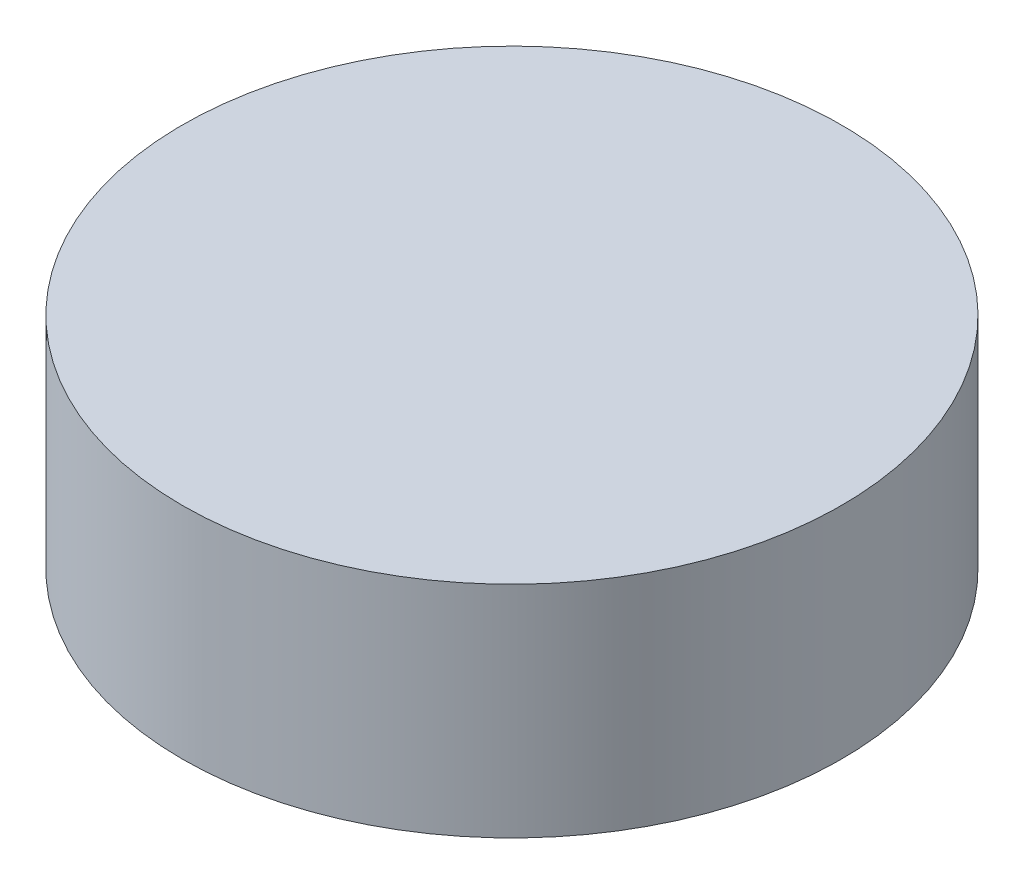
ISO-10303-21;
HEADER;
FILE_DESCRIPTION(('STEP AP214'),'2;1');
FILE_NAME('part.step','',(''),(''),'','','');
FILE_SCHEMA(('AUTOMOTIVE_DESIGN { 1 0 10303 214 1 1 1 1 }'));
ENDSEC;
DATA;
#1=APPLICATION_CONTEXT('core data for automotive mechanical design processes');
#2=APPLICATION_PROTOCOL_DEFINITION('international standard','automotive_design',2000,#1);
#3=PRODUCT_CONTEXT('',#1,'mechanical');
#4=PRODUCT('Part','Part','',(#3));
#5=PRODUCT_RELATED_PRODUCT_CATEGORY('part','',(#4));
#6=PRODUCT_DEFINITION_FORMATION('','',#4);
#7=PRODUCT_DEFINITION_CONTEXT('part definition',#1,'design');
#8=PRODUCT_DEFINITION('design','',#6,#7);
#9=PRODUCT_DEFINITION_SHAPE('','',#8);
#10=(LENGTH_UNIT() NAMED_UNIT(*) SI_UNIT(.MILLI.,.METRE.));
#11=(NAMED_UNIT(*) PLANE_ANGLE_UNIT() SI_UNIT($,.RADIAN.));
#12=(NAMED_UNIT(*) SI_UNIT($,.STERADIAN.) SOLID_ANGLE_UNIT());
#13=UNCERTAINTY_MEASURE_WITH_UNIT(LENGTH_MEASURE(1.E-05),#10,'distance_accuracy_value','');
#14=(GEOMETRIC_REPRESENTATION_CONTEXT(3) GLOBAL_UNCERTAINTY_ASSIGNED_CONTEXT((#13)) GLOBAL_UNIT_ASSIGNED_CONTEXT((#10,
#11,#12)) REPRESENTATION_CONTEXT('',''));
#15=CARTESIAN_POINT('',(0.,0.,0.));
#16=DIRECTION('',(0.,0.,1.));
#17=DIRECTION('',(1.,0.,0.));
#18=AXIS2_PLACEMENT_3D('',#15,#16,#17);
#19=CARTESIAN_POINT('',(0.,100.,0.));
#20=DIRECTION('',(0.,-1.,0.));
#21=DIRECTION('',(0.,0.,-1.));
#22=AXIS2_PLACEMENT_3D('',#19,#20,#21);
#23=CYLINDRICAL_SURFACE('',#22,150.);
#24=CARTESIAN_POINT('',(0.,100.,0.));
#25=DIRECTION('',(0.,1.,0.));
#26=DIRECTION('',(0.,0.,1.));
#27=AXIS2_PLACEMENT_3D('',#24,#25,#26);
#28=CIRCLE('',#27,150.);
#29=CARTESIAN_POINT('',(0.,100.,150.));
#30=VERTEX_POINT('',#29);
#31=EDGE_CURVE('E10',#30,#30,#28,.T.);
#32=ORIENTED_EDGE('',*,*,#31,.F.);
#33=EDGE_LOOP('',(#32));
#34=FACE_BOUND('',#33,.T.);
#35=CARTESIAN_POINT('',(0.,0.,0.));
#36=DIRECTION('',(0.,1.,0.));
#37=DIRECTION('',(0.,0.,1.));
#38=AXIS2_PLACEMENT_3D('',#35,#36,#37);
#39=CIRCLE('',#38,150.);
#40=CARTESIAN_POINT('',(0.,0.,150.));
#41=VERTEX_POINT('',#40);
#42=EDGE_CURVE('E41',#41,#41,#39,.T.);
#43=ORIENTED_EDGE('',*,*,#42,.T.);
#44=EDGE_LOOP('',(#43));
#45=FACE_BOUND('',#44,.T.);
#46=ADVANCED_FACE('F38',(#34,#45),#23,.T.);
#47=CARTESIAN_POINT('',(0.,100.,0.));
#48=DIRECTION('',(0.,1.,0.));
#49=DIRECTION('',(0.,0.,1.));
#50=AXIS2_PLACEMENT_3D('',#47,#48,#49);
#51=PLANE('',#50);
#52=ORIENTED_EDGE('',*,*,#31,.T.);
#53=EDGE_LOOP('',(#52));
#54=FACE_BOUND('',#53,.T.);
#55=ADVANCED_FACE('F53',(#54),#51,.T.);
#56=CARTESIAN_POINT('',(0.,0.,0.));
#57=DIRECTION('',(0.,1.,0.));
#58=DIRECTION('',(0.,0.,1.));
#59=AXIS2_PLACEMENT_3D('',#56,#57,#58);
#60=PLANE('',#59);
#61=ORIENTED_EDGE('',*,*,#42,.F.);
#62=EDGE_LOOP('',(#61));
#63=FACE_BOUND('',#62,.T.);
#64=ADVANCED_FACE('F51',(#63),#60,.F.);
#65=CLOSED_SHELL('',(#46,#55,#64));
#66=MANIFOLD_SOLID_BREP('B2',#65);
#67=ADVANCED_BREP_SHAPE_REPRESENTATION('',(#18,#66),#14);
#68=SHAPE_DEFINITION_REPRESENTATION(#9,#67);
ENDSEC;
END-ISO-10303-21;
